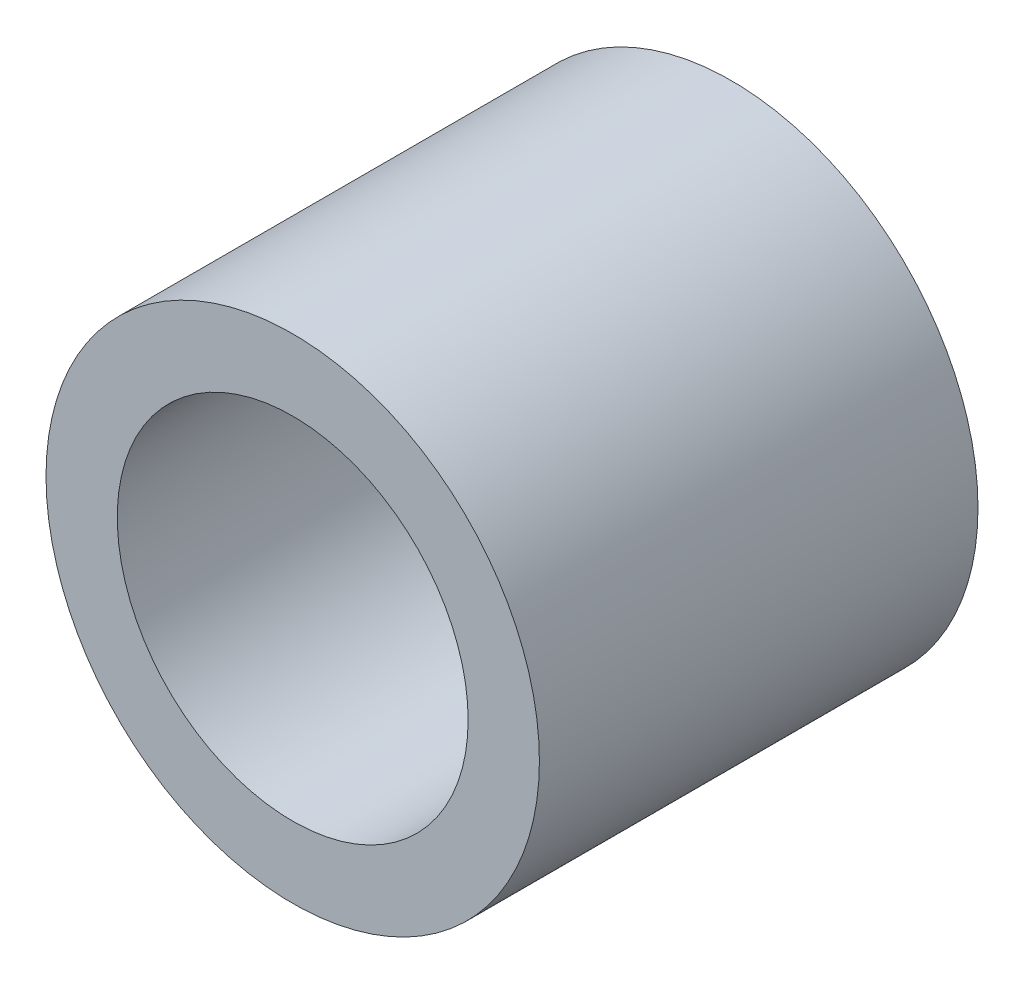
ISO-10303-21;
HEADER;
FILE_DESCRIPTION(('STEP AP214'),'2;1');
FILE_NAME('part.step','',(''),(''),'','','');
FILE_SCHEMA(('AUTOMOTIVE_DESIGN { 1 0 10303 214 1 1 1 1 }'));
ENDSEC;
DATA;
#1=APPLICATION_CONTEXT('core data for automotive mechanical design processes');
#2=APPLICATION_PROTOCOL_DEFINITION('international standard','automotive_design',2000,#1);
#3=PRODUCT_CONTEXT('',#1,'mechanical');
#4=PRODUCT('Part','Part','',(#3));
#5=PRODUCT_RELATED_PRODUCT_CATEGORY('part','',(#4));
#6=PRODUCT_DEFINITION_FORMATION('','',#4);
#7=PRODUCT_DEFINITION_CONTEXT('part definition',#1,'design');
#8=PRODUCT_DEFINITION('design','',#6,#7);
#9=PRODUCT_DEFINITION_SHAPE('','',#8);
#10=(LENGTH_UNIT() NAMED_UNIT(*) SI_UNIT(.MILLI.,.METRE.));
#11=(NAMED_UNIT(*) PLANE_ANGLE_UNIT() SI_UNIT($,.RADIAN.));
#12=(NAMED_UNIT(*) SI_UNIT($,.STERADIAN.) SOLID_ANGLE_UNIT());
#13=UNCERTAINTY_MEASURE_WITH_UNIT(LENGTH_MEASURE(1.E-05),#10,'distance_accuracy_value','');
#14=(GEOMETRIC_REPRESENTATION_CONTEXT(3) GLOBAL_UNCERTAINTY_ASSIGNED_CONTEXT((#13)) GLOBAL_UNIT_ASSIGNED_CONTEXT((#10,
#11,#12)) REPRESENTATION_CONTEXT('',''));
#15=CARTESIAN_POINT('',(0.,0.,0.));
#16=DIRECTION('',(0.,0.,1.));
#17=DIRECTION('',(1.,0.,0.));
#18=AXIS2_PLACEMENT_3D('',#15,#16,#17);
#19=CARTESIAN_POINT('',(0.,0.,2.));
#20=DIRECTION('',(0.,0.,1.));
#21=DIRECTION('',(1.,0.,0.));
#22=AXIS2_PLACEMENT_3D('',#19,#20,#21);
#23=PLANE('',#22);
#24=CARTESIAN_POINT('',(0.,0.,2.));
#25=DIRECTION('',(0.,0.,1.));
#26=DIRECTION('',(1.,0.,0.));
#27=AXIS2_PLACEMENT_3D('',#24,#25,#26);
#28=CIRCLE('',#27,2.25);
#29=CARTESIAN_POINT('',(2.25,0.,2.));
#30=VERTEX_POINT('',#29);
#31=EDGE_CURVE('E10',#30,#30,#28,.T.);
#32=ORIENTED_EDGE('',*,*,#31,.T.);
#33=EDGE_LOOP('',(#32));
#34=FACE_BOUND('',#33,.T.);
#35=CARTESIAN_POINT('',(0.,0.,2.));
#36=DIRECTION('',(0.,0.,1.));
#37=DIRECTION('',(1.,0.,0.));
#38=AXIS2_PLACEMENT_3D('',#35,#36,#37);
#39=CIRCLE('',#38,1.6);
#40=CARTESIAN_POINT('',(1.6,0.,2.));
#41=VERTEX_POINT('',#40);
#42=EDGE_CURVE('E37',#41,#41,#39,.T.);
#43=ORIENTED_EDGE('',*,*,#42,.F.);
#44=EDGE_LOOP('',(#43));
#45=FACE_BOUND('',#44,.T.);
#46=ADVANCED_FACE('F30',(#34,#45),#23,.T.);
#47=CARTESIAN_POINT('',(0.,0.,2.));
#48=DIRECTION('',(0.,0.,-1.));
#49=DIRECTION('',(-1.,0.,0.));
#50=AXIS2_PLACEMENT_3D('',#47,#48,#49);
#51=CYLINDRICAL_SURFACE('',#50,2.25);
#52=ORIENTED_EDGE('',*,*,#31,.F.);
#53=EDGE_LOOP('',(#52));
#54=FACE_BOUND('',#53,.T.);
#55=CARTESIAN_POINT('',(0.,0.,-2.));
#56=DIRECTION('',(0.,0.,1.));
#57=DIRECTION('',(1.,0.,0.));
#58=AXIS2_PLACEMENT_3D('',#55,#56,#57);
#59=CIRCLE('',#58,2.25);
#60=CARTESIAN_POINT('',(2.25,0.,-2.));
#61=VERTEX_POINT('',#60);
#62=EDGE_CURVE('E41',#61,#61,#59,.T.);
#63=ORIENTED_EDGE('',*,*,#62,.T.);
#64=EDGE_LOOP('',(#63));
#65=FACE_BOUND('',#64,.T.);
#66=ADVANCED_FACE('F32',(#54,#65),#51,.T.);
#67=CARTESIAN_POINT('',(0.,0.,2.));
#68=DIRECTION('',(0.,0.,-1.));
#69=DIRECTION('',(-1.,0.,0.));
#70=AXIS2_PLACEMENT_3D('',#67,#68,#69);
#71=CYLINDRICAL_SURFACE('',#70,1.6);
#72=ORIENTED_EDGE('',*,*,#42,.T.);
#73=EDGE_LOOP('',(#72));
#74=FACE_BOUND('',#73,.T.);
#75=CARTESIAN_POINT('',(0.,0.,-2.));
#76=DIRECTION('',(0.,0.,1.));
#77=DIRECTION('',(1.,0.,0.));
#78=AXIS2_PLACEMENT_3D('',#75,#76,#77);
#79=CIRCLE('',#78,1.6);
#80=CARTESIAN_POINT('',(1.6,0.,-2.));
#81=VERTEX_POINT('',#80);
#82=EDGE_CURVE('E45',#81,#81,#79,.T.);
#83=ORIENTED_EDGE('',*,*,#82,.F.);
#84=EDGE_LOOP('',(#83));
#85=FACE_BOUND('',#84,.T.);
#86=ADVANCED_FACE('F54',(#74,#85),#71,.F.);
#87=CARTESIAN_POINT('',(0.,0.,-2.));
#88=DIRECTION('',(0.,0.,1.));
#89=DIRECTION('',(1.,0.,0.));
#90=AXIS2_PLACEMENT_3D('',#87,#88,#89);
#91=PLANE('',#90);
#92=ORIENTED_EDGE('',*,*,#82,.T.);
#93=EDGE_LOOP('',(#92));
#94=FACE_BOUND('',#93,.T.);
#95=ORIENTED_EDGE('',*,*,#62,.F.);
#96=EDGE_LOOP('',(#95));
#97=FACE_BOUND('',#96,.T.);
#98=ADVANCED_FACE('F51',(#94,#97),#91,.F.);
#99=CLOSED_SHELL('',(#46,#66,#86,#98));
#100=MANIFOLD_SOLID_BREP('B2',#99);
#101=ADVANCED_BREP_SHAPE_REPRESENTATION('',(#18,#100),#14);
#102=SHAPE_DEFINITION_REPRESENTATION(#9,#101);
ENDSEC;
END-ISO-10303-21;
